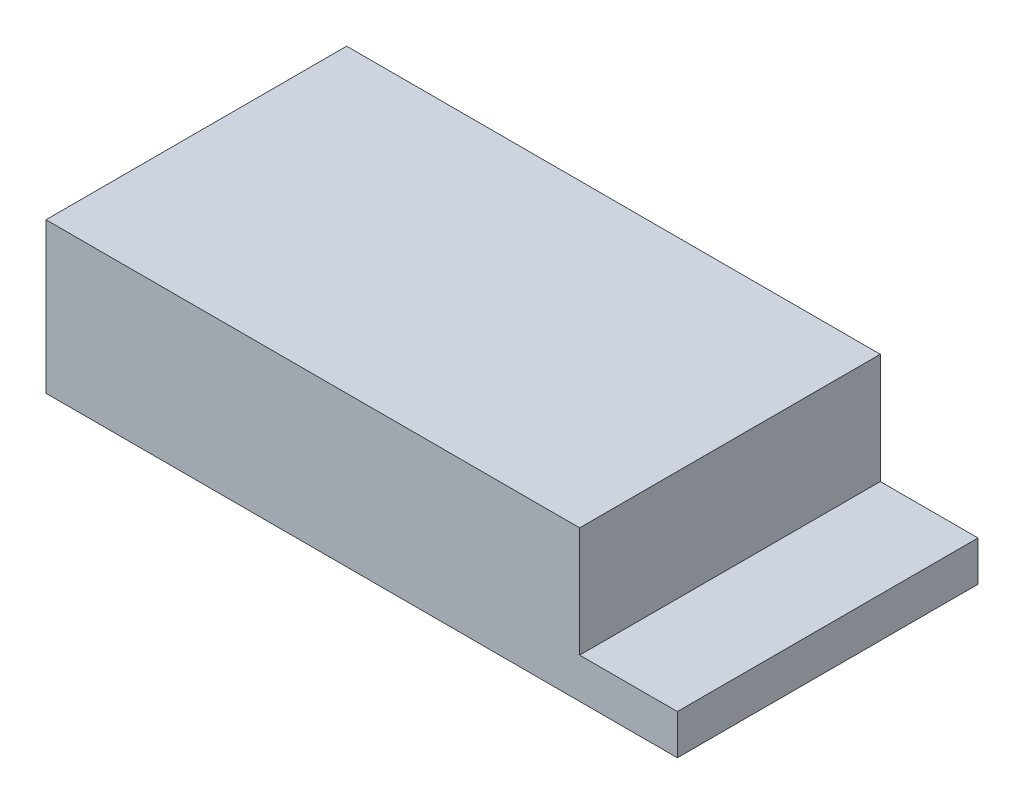
ISO-10303-21;
HEADER;
FILE_DESCRIPTION(('STEP AP214'),'2;1');
FILE_NAME('part.step','',(''),(''),'','','');
FILE_SCHEMA(('AUTOMOTIVE_DESIGN { 1 0 10303 214 1 1 1 1 }'));
ENDSEC;
DATA;
#1=APPLICATION_CONTEXT('core data for automotive mechanical design processes');
#2=APPLICATION_PROTOCOL_DEFINITION('international standard','automotive_design',2000,#1);
#3=PRODUCT_CONTEXT('',#1,'mechanical');
#4=PRODUCT('Part','Part','',(#3));
#5=PRODUCT_RELATED_PRODUCT_CATEGORY('part','',(#4));
#6=PRODUCT_DEFINITION_FORMATION('','',#4);
#7=PRODUCT_DEFINITION_CONTEXT('part definition',#1,'design');
#8=PRODUCT_DEFINITION('design','',#6,#7);
#9=PRODUCT_DEFINITION_SHAPE('','',#8);
#10=(LENGTH_UNIT() NAMED_UNIT(*) SI_UNIT(.MILLI.,.METRE.));
#11=(NAMED_UNIT(*) PLANE_ANGLE_UNIT() SI_UNIT($,.RADIAN.));
#12=(NAMED_UNIT(*) SI_UNIT($,.STERADIAN.) SOLID_ANGLE_UNIT());
#13=UNCERTAINTY_MEASURE_WITH_UNIT(LENGTH_MEASURE(1.E-05),#10,'distance_accuracy_value','');
#14=(GEOMETRIC_REPRESENTATION_CONTEXT(3) GLOBAL_UNCERTAINTY_ASSIGNED_CONTEXT((#13)) GLOBAL_UNIT_ASSIGNED_CONTEXT((#10,
#11,#12)) REPRESENTATION_CONTEXT('',''));
#15=CARTESIAN_POINT('',(0.,0.,0.));
#16=DIRECTION('',(0.,0.,1.));
#17=DIRECTION('',(1.,0.,0.));
#18=AXIS2_PLACEMENT_3D('',#15,#16,#17);
#19=CARTESIAN_POINT('',(630.,300.,300.));
#20=DIRECTION('',(-1.,0.,0.));
#21=DIRECTION('',(0.,0.,1.));
#22=AXIS2_PLACEMENT_3D('',#19,#20,#21);
#23=PLANE('',#22);
#24=DIRECTION('',(0.,0.,-1.));
#25=VECTOR('',#24,1.);
#26=CARTESIAN_POINT('',(630.,80.,300.));
#27=LINE('',#26,#25);
#28=CARTESIAN_POINT('',(630.,80.,300.));
#29=VERTEX_POINT('',#28);
#30=CARTESIAN_POINT('',(630.,80.,-300.));
#31=VERTEX_POINT('',#30);
#32=EDGE_CURVE('E95',#29,#31,#27,.T.);
#33=ORIENTED_EDGE('',*,*,#32,.F.);
#34=DIRECTION('',(0.,-1.,0.));
#35=VECTOR('',#34,1.);
#36=CARTESIAN_POINT('',(630.,300.,300.));
#37=LINE('',#36,#35);
#38=CARTESIAN_POINT('',(630.,0.,300.));
#39=VERTEX_POINT('',#38);
#40=EDGE_CURVE('E88',#29,#39,#37,.T.);
#41=ORIENTED_EDGE('',*,*,#40,.T.);
#42=DIRECTION('',(0.,0.,-1.));
#43=VECTOR('',#42,1.);
#44=CARTESIAN_POINT('',(630.,0.,300.));
#45=LINE('',#44,#43);
#46=CARTESIAN_POINT('',(630.,0.,-300.));
#47=VERTEX_POINT('',#46);
#48=EDGE_CURVE('E92',#39,#47,#45,.T.);
#49=ORIENTED_EDGE('',*,*,#48,.T.);
#50=DIRECTION('',(0.,-1.,0.));
#51=VECTOR('',#50,1.);
#52=CARTESIAN_POINT('',(630.,300.,-300.));
#53=LINE('',#52,#51);
#54=EDGE_CURVE('E11',#31,#47,#53,.T.);
#55=ORIENTED_EDGE('',*,*,#54,.F.);
#56=EDGE_LOOP('',(#33,#41,#49,#55));
#57=FACE_BOUND('',#56,.T.);
#58=ADVANCED_FACE('F45',(#57),#23,.F.);
#59=CARTESIAN_POINT('',(-630.,300.,-300.));
#60=DIRECTION('',(0.,0.,1.));
#61=DIRECTION('',(1.,0.,0.));
#62=AXIS2_PLACEMENT_3D('',#59,#60,#61);
#63=PLANE('',#62);
#64=DIRECTION('',(-1.,0.,0.));
#65=VECTOR('',#64,1.);
#66=CARTESIAN_POINT('',(-630.,300.,-300.));
#67=LINE('',#66,#65);
#68=CARTESIAN_POINT('',(435.,300.,-300.));
#69=VERTEX_POINT('',#68);
#70=CARTESIAN_POINT('',(-630.,300.,-300.));
#71=VERTEX_POINT('',#70);
#72=EDGE_CURVE('E110',#69,#71,#67,.T.);
#73=ORIENTED_EDGE('',*,*,#72,.F.);
#74=DIRECTION('',(0.,1.,0.));
#75=VECTOR('',#74,1.);
#76=CARTESIAN_POINT('',(435.,80.,-300.));
#77=LINE('',#76,#75);
#78=CARTESIAN_POINT('',(435.,80.,-300.));
#79=VERTEX_POINT('',#78);
#80=EDGE_CURVE('E60',#79,#69,#77,.T.);
#81=ORIENTED_EDGE('',*,*,#80,.F.);
#82=DIRECTION('',(-1.,0.,0.));
#83=VECTOR('',#82,1.);
#84=CARTESIAN_POINT('',(630.,80.,-300.));
#85=LINE('',#84,#83);
#86=EDGE_CURVE('E140',#31,#79,#85,.T.);
#87=ORIENTED_EDGE('',*,*,#86,.F.);
#88=ORIENTED_EDGE('',*,*,#54,.T.);
#89=DIRECTION('',(-1.,0.,0.));
#90=VECTOR('',#89,1.);
#91=CARTESIAN_POINT('',(-630.,0.,-300.));
#92=LINE('',#91,#90);
#93=CARTESIAN_POINT('',(-630.,0.,-300.));
#94=VERTEX_POINT('',#93);
#95=EDGE_CURVE('E115',#47,#94,#92,.T.);
#96=ORIENTED_EDGE('',*,*,#95,.T.);
#97=DIRECTION('',(0.,-1.,0.));
#98=VECTOR('',#97,1.);
#99=CARTESIAN_POINT('',(-630.,300.,-300.));
#100=LINE('',#99,#98);
#101=EDGE_CURVE('E53',#71,#94,#100,.T.);
#102=ORIENTED_EDGE('',*,*,#101,.F.);
#103=EDGE_LOOP('',(#73,#81,#87,#88,#96,#102));
#104=FACE_BOUND('',#103,.T.);
#105=ADVANCED_FACE('F137',(#104),#63,.F.);
#106=CARTESIAN_POINT('',(-630.,300.,300.));
#107=DIRECTION('',(1.,0.,0.));
#108=DIRECTION('',(0.,0.,-1.));
#109=AXIS2_PLACEMENT_3D('',#106,#107,#108);
#110=PLANE('',#109);
#111=DIRECTION('',(0.,0.,1.));
#112=VECTOR('',#111,1.);
#113=CARTESIAN_POINT('',(-630.,0.,300.));
#114=LINE('',#113,#112);
#115=CARTESIAN_POINT('',(-630.,0.,300.));
#116=VERTEX_POINT('',#115);
#117=EDGE_CURVE('E111',#94,#116,#114,.T.);
#118=ORIENTED_EDGE('',*,*,#117,.T.);
#119=DIRECTION('',(0.,-1.,0.));
#120=VECTOR('',#119,1.);
#121=CARTESIAN_POINT('',(-630.,300.,300.));
#122=LINE('',#121,#120);
#123=CARTESIAN_POINT('',(-630.,300.,300.));
#124=VERTEX_POINT('',#123);
#125=EDGE_CURVE('E99',#124,#116,#122,.T.);
#126=ORIENTED_EDGE('',*,*,#125,.F.);
#127=DIRECTION('',(0.,0.,1.));
#128=VECTOR('',#127,1.);
#129=CARTESIAN_POINT('',(-630.,300.,300.));
#130=LINE('',#129,#128);
#131=EDGE_CURVE('E69',#71,#124,#130,.T.);
#132=ORIENTED_EDGE('',*,*,#131,.F.);
#133=ORIENTED_EDGE('',*,*,#101,.T.);
#134=EDGE_LOOP('',(#118,#126,#132,#133));
#135=FACE_BOUND('',#134,.T.);
#136=ADVANCED_FACE('F134',(#135),#110,.F.);
#137=CARTESIAN_POINT('',(-630.,300.,300.));
#138=DIRECTION('',(0.,0.,-1.));
#139=DIRECTION('',(-1.,0.,0.));
#140=AXIS2_PLACEMENT_3D('',#137,#138,#139);
#141=PLANE('',#140);
#142=DIRECTION('',(1.,0.,0.));
#143=VECTOR('',#142,1.);
#144=CARTESIAN_POINT('',(435.,80.,300.));
#145=LINE('',#144,#143);
#146=CARTESIAN_POINT('',(435.,80.,300.));
#147=VERTEX_POINT('',#146);
#148=EDGE_CURVE('E156',#147,#29,#145,.T.);
#149=ORIENTED_EDGE('',*,*,#148,.F.);
#150=DIRECTION('',(0.,1.,0.));
#151=VECTOR('',#150,1.);
#152=CARTESIAN_POINT('',(435.,80.,300.));
#153=LINE('',#152,#151);
#154=CARTESIAN_POINT('',(435.,300.,300.));
#155=VERTEX_POINT('',#154);
#156=EDGE_CURVE('E117',#147,#155,#153,.T.);
#157=ORIENTED_EDGE('',*,*,#156,.T.);
#158=DIRECTION('',(1.,0.,0.));
#159=VECTOR('',#158,1.);
#160=CARTESIAN_POINT('',(-630.,300.,300.));
#161=LINE('',#160,#159);
#162=EDGE_CURVE('E100',#124,#155,#161,.T.);
#163=ORIENTED_EDGE('',*,*,#162,.F.);
#164=ORIENTED_EDGE('',*,*,#125,.T.);
#165=DIRECTION('',(1.,0.,0.));
#166=VECTOR('',#165,1.);
#167=CARTESIAN_POINT('',(-630.,0.,300.));
#168=LINE('',#167,#166);
#169=EDGE_CURVE('E104',#116,#39,#168,.T.);
#170=ORIENTED_EDGE('',*,*,#169,.T.);
#171=ORIENTED_EDGE('',*,*,#40,.F.);
#172=EDGE_LOOP('',(#149,#157,#163,#164,#170,#171));
#173=FACE_BOUND('',#172,.T.);
#174=ADVANCED_FACE('F105',(#173),#141,.F.);
#175=CARTESIAN_POINT('',(0.,300.,0.));
#176=DIRECTION('',(0.,-1.,0.));
#177=DIRECTION('',(0.,0.,-1.));
#178=AXIS2_PLACEMENT_3D('',#175,#176,#177);
#179=PLANE('',#178);
#180=ORIENTED_EDGE('',*,*,#162,.T.);
#181=DIRECTION('',(0.,0.,1.));
#182=VECTOR('',#181,1.);
#183=CARTESIAN_POINT('',(435.,300.,-300.));
#184=LINE('',#183,#182);
#185=EDGE_CURVE('E150',#69,#155,#184,.T.);
#186=ORIENTED_EDGE('',*,*,#185,.F.);
#187=ORIENTED_EDGE('',*,*,#72,.T.);
#188=ORIENTED_EDGE('',*,*,#131,.T.);
#189=EDGE_LOOP('',(#180,#186,#187,#188));
#190=FACE_BOUND('',#189,.T.);
#191=ADVANCED_FACE('F172',(#190),#179,.F.);
#192=CARTESIAN_POINT('',(0.,0.,0.));
#193=DIRECTION('',(0.,-1.,0.));
#194=DIRECTION('',(0.,0.,-1.));
#195=AXIS2_PLACEMENT_3D('',#192,#193,#194);
#196=PLANE('',#195);
#197=ORIENTED_EDGE('',*,*,#48,.F.);
#198=ORIENTED_EDGE('',*,*,#169,.F.);
#199=ORIENTED_EDGE('',*,*,#117,.F.);
#200=ORIENTED_EDGE('',*,*,#95,.F.);
#201=EDGE_LOOP('',(#197,#198,#199,#200));
#202=FACE_BOUND('',#201,.T.);
#203=ADVANCED_FACE('F114',(#202),#196,.T.);
#204=CARTESIAN_POINT('',(435.,80.,-300.));
#205=DIRECTION('',(-1.,0.,0.));
#206=DIRECTION('',(0.,0.,1.));
#207=AXIS2_PLACEMENT_3D('',#204,#205,#206);
#208=PLANE('',#207);
#209=ORIENTED_EDGE('',*,*,#185,.T.);
#210=ORIENTED_EDGE('',*,*,#156,.F.);
#211=DIRECTION('',(0.,0.,1.));
#212=VECTOR('',#211,1.);
#213=CARTESIAN_POINT('',(435.,80.,-300.));
#214=LINE('',#213,#212);
#215=EDGE_CURVE('E153',#79,#147,#214,.T.);
#216=ORIENTED_EDGE('',*,*,#215,.F.);
#217=ORIENTED_EDGE('',*,*,#80,.T.);
#218=EDGE_LOOP('',(#209,#210,#216,#217));
#219=FACE_BOUND('',#218,.T.);
#220=ADVANCED_FACE('F154',(#219),#208,.F.);
#221=CARTESIAN_POINT('',(0.,80.,0.));
#222=DIRECTION('',(0.,1.,0.));
#223=DIRECTION('',(0.,0.,1.));
#224=AXIS2_PLACEMENT_3D('',#221,#222,#223);
#225=PLANE('',#224);
#226=ORIENTED_EDGE('',*,*,#86,.T.);
#227=ORIENTED_EDGE('',*,*,#215,.T.);
#228=ORIENTED_EDGE('',*,*,#148,.T.);
#229=ORIENTED_EDGE('',*,*,#32,.T.);
#230=EDGE_LOOP('',(#226,#227,#228,#229));
#231=FACE_BOUND('',#230,.T.);
#232=ADVANCED_FACE('F155',(#231),#225,.T.);
#233=CLOSED_SHELL('',(#58,#105,#136,#174,#191,#203,#220,#232));
#234=MANIFOLD_SOLID_BREP('B2',#233);
#235=ADVANCED_BREP_SHAPE_REPRESENTATION('',(#18,#234),#14);
#236=SHAPE_DEFINITION_REPRESENTATION(#9,#235);
ENDSEC;
END-ISO-10303-21;
